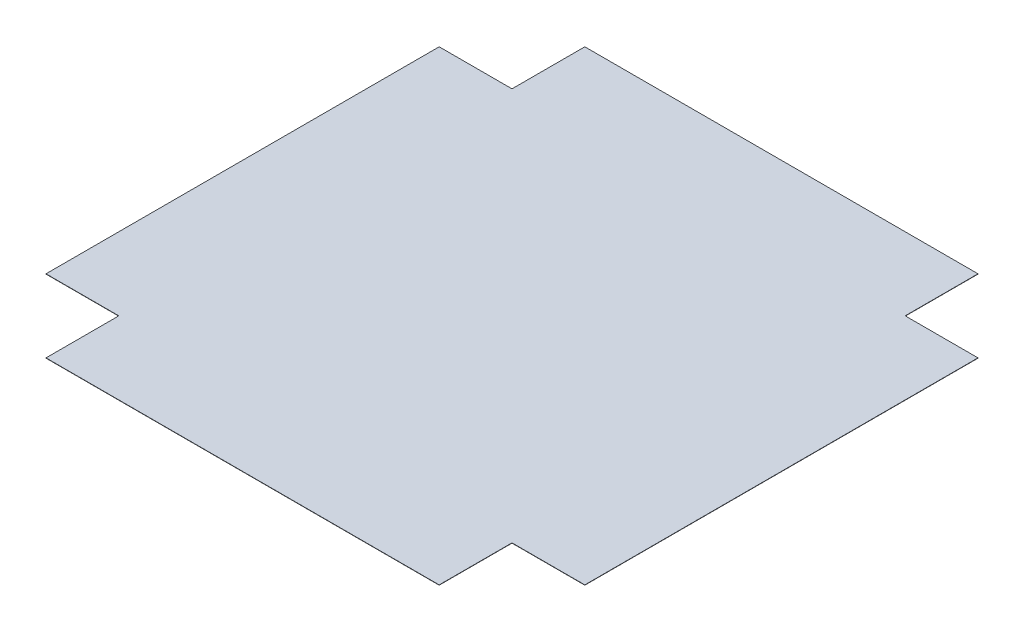
ISO-10303-21;
HEADER;
FILE_DESCRIPTION(('STEP AP214'),'2;1');
FILE_NAME('part.step','',(''),(''),'','','');
FILE_SCHEMA(('AUTOMOTIVE_DESIGN { 1 0 10303 214 1 1 1 1 }'));
ENDSEC;
DATA;
#1=APPLICATION_CONTEXT('core data for automotive mechanical design processes');
#2=APPLICATION_PROTOCOL_DEFINITION('international standard','automotive_design',2000,#1);
#3=PRODUCT_CONTEXT('',#1,'mechanical');
#4=PRODUCT('Part','Part','',(#3));
#5=PRODUCT_RELATED_PRODUCT_CATEGORY('part','',(#4));
#6=PRODUCT_DEFINITION_FORMATION('','',#4);
#7=PRODUCT_DEFINITION_CONTEXT('part definition',#1,'design');
#8=PRODUCT_DEFINITION('design','',#6,#7);
#9=PRODUCT_DEFINITION_SHAPE('','',#8);
#10=(LENGTH_UNIT() NAMED_UNIT(*) SI_UNIT(.MILLI.,.METRE.));
#11=(NAMED_UNIT(*) PLANE_ANGLE_UNIT() SI_UNIT($,.RADIAN.));
#12=(NAMED_UNIT(*) SI_UNIT($,.STERADIAN.) SOLID_ANGLE_UNIT());
#13=UNCERTAINTY_MEASURE_WITH_UNIT(LENGTH_MEASURE(1.E-05),#10,'distance_accuracy_value','');
#14=(GEOMETRIC_REPRESENTATION_CONTEXT(3) GLOBAL_UNCERTAINTY_ASSIGNED_CONTEXT((#13)) GLOBAL_UNIT_ASSIGNED_CONTEXT((#10,
#11,#12)) REPRESENTATION_CONTEXT('',''));
#15=CARTESIAN_POINT('',(0.,0.,0.));
#16=DIRECTION('',(0.,0.,1.));
#17=DIRECTION('',(1.,0.,0.));
#18=AXIS2_PLACEMENT_3D('',#15,#16,#17);
#19=CARTESIAN_POINT('',(-67.5,0.05,-67.5));
#20=DIRECTION('',(1.,0.,0.));
#21=DIRECTION('',(0.,0.,-1.));
#22=AXIS2_PLACEMENT_3D('',#19,#20,#21);
#23=PLANE('',#22);
#24=DIRECTION('',(0.,0.,1.));
#25=VECTOR('',#24,1.);
#26=CARTESIAN_POINT('',(-67.5,-0.05,-67.5));
#27=LINE('',#26,#25);
#28=CARTESIAN_POINT('',(-67.5,-0.05,-92.5));
#29=VERTEX_POINT('',#28);
#30=CARTESIAN_POINT('',(-67.5,-0.05,-67.5));
#31=VERTEX_POINT('',#30);
#32=EDGE_CURVE('E166',#29,#31,#27,.T.);
#33=ORIENTED_EDGE('',*,*,#32,.T.);
#34=DIRECTION('',(0.,-1.,0.));
#35=VECTOR('',#34,1.);
#36=CARTESIAN_POINT('',(-67.5,0.05,-67.5));
#37=LINE('',#36,#35);
#38=CARTESIAN_POINT('',(-67.5,0.05,-67.5));
#39=VERTEX_POINT('',#38);
#40=EDGE_CURVE('E11',#39,#31,#37,.T.);
#41=ORIENTED_EDGE('',*,*,#40,.F.);
#42=DIRECTION('',(0.,0.,1.));
#43=VECTOR('',#42,1.);
#44=CARTESIAN_POINT('',(-67.5,0.05,-67.5));
#45=LINE('',#44,#43);
#46=CARTESIAN_POINT('',(-67.5,0.05,-92.5));
#47=VERTEX_POINT('',#46);
#48=EDGE_CURVE('E191',#47,#39,#45,.T.);
#49=ORIENTED_EDGE('',*,*,#48,.F.);
#50=DIRECTION('',(0.,-1.,0.));
#51=VECTOR('',#50,1.);
#52=CARTESIAN_POINT('',(-67.5,0.05,-92.5));
#53=LINE('',#52,#51);
#54=EDGE_CURVE('E162',#47,#29,#53,.T.);
#55=ORIENTED_EDGE('',*,*,#54,.T.);
#56=EDGE_LOOP('',(#33,#41,#49,#55));
#57=FACE_BOUND('',#56,.T.);
#58=ADVANCED_FACE('F42',(#57),#23,.F.);
#59=CARTESIAN_POINT('',(-92.5,0.05,-67.5));
#60=DIRECTION('',(0.,0.,1.));
#61=DIRECTION('',(1.,0.,0.));
#62=AXIS2_PLACEMENT_3D('',#59,#60,#61);
#63=PLANE('',#62);
#64=DIRECTION('',(-1.,0.,0.));
#65=VECTOR('',#64,1.);
#66=CARTESIAN_POINT('',(-92.5,-0.05,-67.5));
#67=LINE('',#66,#65);
#68=CARTESIAN_POINT('',(-92.5,-0.05,-67.5));
#69=VERTEX_POINT('',#68);
#70=EDGE_CURVE('E169',#31,#69,#67,.T.);
#71=ORIENTED_EDGE('',*,*,#70,.T.);
#72=DIRECTION('',(0.,-1.,0.));
#73=VECTOR('',#72,1.);
#74=CARTESIAN_POINT('',(-92.5,0.05,-67.5));
#75=LINE('',#74,#73);
#76=CARTESIAN_POINT('',(-92.5,0.05,-67.5));
#77=VERTEX_POINT('',#76);
#78=EDGE_CURVE('E50',#77,#69,#75,.T.);
#79=ORIENTED_EDGE('',*,*,#78,.F.);
#80=DIRECTION('',(-1.,0.,0.));
#81=VECTOR('',#80,1.);
#82=CARTESIAN_POINT('',(-92.5,0.05,-67.5));
#83=LINE('',#82,#81);
#84=EDGE_CURVE('E115',#39,#77,#83,.T.);
#85=ORIENTED_EDGE('',*,*,#84,.F.);
#86=ORIENTED_EDGE('',*,*,#40,.T.);
#87=EDGE_LOOP('',(#71,#79,#85,#86));
#88=FACE_BOUND('',#87,.T.);
#89=ADVANCED_FACE('F274',(#88),#63,.F.);
#90=CARTESIAN_POINT('',(-92.5,0.05,67.5));
#91=DIRECTION('',(1.,0.,0.));
#92=DIRECTION('',(0.,0.,-1.));
#93=AXIS2_PLACEMENT_3D('',#90,#91,#92);
#94=PLANE('',#93);
#95=DIRECTION('',(0.,0.,1.));
#96=VECTOR('',#95,1.);
#97=CARTESIAN_POINT('',(-92.5,-0.05,67.5));
#98=LINE('',#97,#96);
#99=CARTESIAN_POINT('',(-92.5,-0.05,67.5));
#100=VERTEX_POINT('',#99);
#101=EDGE_CURVE('E171',#69,#100,#98,.T.);
#102=ORIENTED_EDGE('',*,*,#101,.T.);
#103=DIRECTION('',(0.,-1.,0.));
#104=VECTOR('',#103,1.);
#105=CARTESIAN_POINT('',(-92.5,0.05,67.5));
#106=LINE('',#105,#104);
#107=CARTESIAN_POINT('',(-92.5,0.05,67.5));
#108=VERTEX_POINT('',#107);
#109=EDGE_CURVE('E212',#108,#100,#106,.T.);
#110=ORIENTED_EDGE('',*,*,#109,.F.);
#111=DIRECTION('',(0.,0.,1.));
#112=VECTOR('',#111,1.);
#113=CARTESIAN_POINT('',(-92.5,0.05,67.5));
#114=LINE('',#113,#112);
#115=EDGE_CURVE('E220',#77,#108,#114,.T.);
#116=ORIENTED_EDGE('',*,*,#115,.F.);
#117=ORIENTED_EDGE('',*,*,#78,.T.);
#118=EDGE_LOOP('',(#102,#110,#116,#117));
#119=FACE_BOUND('',#118,.T.);
#120=ADVANCED_FACE('F218',(#119),#94,.F.);
#121=CARTESIAN_POINT('',(-67.5,0.05,67.5));
#122=DIRECTION('',(0.,0.,-1.));
#123=DIRECTION('',(-1.,0.,0.));
#124=AXIS2_PLACEMENT_3D('',#121,#122,#123);
#125=PLANE('',#124);
#126=DIRECTION('',(1.,0.,0.));
#127=VECTOR('',#126,1.);
#128=CARTESIAN_POINT('',(-67.5,-0.05,67.5));
#129=LINE('',#128,#127);
#130=CARTESIAN_POINT('',(-67.5,-0.05,67.5));
#131=VERTEX_POINT('',#130);
#132=EDGE_CURVE('E173',#100,#131,#129,.T.);
#133=ORIENTED_EDGE('',*,*,#132,.T.);
#134=DIRECTION('',(0.,-1.,0.));
#135=VECTOR('',#134,1.);
#136=CARTESIAN_POINT('',(-67.5,0.05,67.5));
#137=LINE('',#136,#135);
#138=CARTESIAN_POINT('',(-67.5,0.05,67.5));
#139=VERTEX_POINT('',#138);
#140=EDGE_CURVE('E209',#139,#131,#137,.T.);
#141=ORIENTED_EDGE('',*,*,#140,.F.);
#142=DIRECTION('',(1.,0.,0.));
#143=VECTOR('',#142,1.);
#144=CARTESIAN_POINT('',(-67.5,0.05,67.5));
#145=LINE('',#144,#143);
#146=EDGE_CURVE('E239',#108,#139,#145,.T.);
#147=ORIENTED_EDGE('',*,*,#146,.F.);
#148=ORIENTED_EDGE('',*,*,#109,.T.);
#149=EDGE_LOOP('',(#133,#141,#147,#148));
#150=FACE_BOUND('',#149,.T.);
#151=ADVANCED_FACE('F229',(#150),#125,.F.);
#152=CARTESIAN_POINT('',(-67.5,0.05,92.5));
#153=DIRECTION('',(1.,0.,0.));
#154=DIRECTION('',(0.,0.,-1.));
#155=AXIS2_PLACEMENT_3D('',#152,#153,#154);
#156=PLANE('',#155);
#157=DIRECTION('',(0.,0.,1.));
#158=VECTOR('',#157,1.);
#159=CARTESIAN_POINT('',(-67.5,-0.05,92.5));
#160=LINE('',#159,#158);
#161=CARTESIAN_POINT('',(-67.5,-0.05,92.5));
#162=VERTEX_POINT('',#161);
#163=EDGE_CURVE('E175',#131,#162,#160,.T.);
#164=ORIENTED_EDGE('',*,*,#163,.T.);
#165=DIRECTION('',(0.,-1.,0.));
#166=VECTOR('',#165,1.);
#167=CARTESIAN_POINT('',(-67.5,0.05,92.5));
#168=LINE('',#167,#166);
#169=CARTESIAN_POINT('',(-67.5,0.05,92.5));
#170=VERTEX_POINT('',#169);
#171=EDGE_CURVE('E205',#170,#162,#168,.T.);
#172=ORIENTED_EDGE('',*,*,#171,.F.);
#173=DIRECTION('',(0.,0.,1.));
#174=VECTOR('',#173,1.);
#175=CARTESIAN_POINT('',(-67.5,0.05,92.5));
#176=LINE('',#175,#174);
#177=EDGE_CURVE('E235',#139,#170,#176,.T.);
#178=ORIENTED_EDGE('',*,*,#177,.F.);
#179=ORIENTED_EDGE('',*,*,#140,.T.);
#180=EDGE_LOOP('',(#164,#172,#178,#179));
#181=FACE_BOUND('',#180,.T.);
#182=ADVANCED_FACE('F233',(#181),#156,.F.);
#183=CARTESIAN_POINT('',(67.5,0.05,92.5));
#184=DIRECTION('',(0.,0.,-1.));
#185=DIRECTION('',(-1.,0.,0.));
#186=AXIS2_PLACEMENT_3D('',#183,#184,#185);
#187=PLANE('',#186);
#188=DIRECTION('',(1.,0.,0.));
#189=VECTOR('',#188,1.);
#190=CARTESIAN_POINT('',(67.5,-0.05,92.5));
#191=LINE('',#190,#189);
#192=CARTESIAN_POINT('',(67.5,-0.05,92.5));
#193=VERTEX_POINT('',#192);
#194=EDGE_CURVE('E178',#162,#193,#191,.T.);
#195=ORIENTED_EDGE('',*,*,#194,.T.);
#196=DIRECTION('',(0.,-1.,0.));
#197=VECTOR('',#196,1.);
#198=CARTESIAN_POINT('',(67.5,0.05,92.5));
#199=LINE('',#198,#197);
#200=CARTESIAN_POINT('',(67.5,0.05,92.5));
#201=VERTEX_POINT('',#200);
#202=EDGE_CURVE('E201',#201,#193,#199,.T.);
#203=ORIENTED_EDGE('',*,*,#202,.F.);
#204=DIRECTION('',(1.,0.,0.));
#205=VECTOR('',#204,1.);
#206=CARTESIAN_POINT('',(67.5,0.05,92.5));
#207=LINE('',#206,#205);
#208=EDGE_CURVE('E238',#170,#201,#207,.T.);
#209=ORIENTED_EDGE('',*,*,#208,.F.);
#210=ORIENTED_EDGE('',*,*,#171,.T.);
#211=EDGE_LOOP('',(#195,#203,#209,#210));
#212=FACE_BOUND('',#211,.T.);
#213=ADVANCED_FACE('F287',(#212),#187,.F.);
#214=CARTESIAN_POINT('',(67.5,0.05,67.5));
#215=DIRECTION('',(-1.,0.,0.));
#216=DIRECTION('',(0.,0.,1.));
#217=AXIS2_PLACEMENT_3D('',#214,#215,#216);
#218=PLANE('',#217);
#219=DIRECTION('',(0.,0.,-1.));
#220=VECTOR('',#219,1.);
#221=CARTESIAN_POINT('',(67.5,-0.05,67.5));
#222=LINE('',#221,#220);
#223=CARTESIAN_POINT('',(67.5,-0.05,67.5));
#224=VERTEX_POINT('',#223);
#225=EDGE_CURVE('E181',#193,#224,#222,.T.);
#226=ORIENTED_EDGE('',*,*,#225,.T.);
#227=DIRECTION('',(0.,-1.,0.));
#228=VECTOR('',#227,1.);
#229=CARTESIAN_POINT('',(67.5,0.05,67.5));
#230=LINE('',#229,#228);
#231=CARTESIAN_POINT('',(67.5,0.05,67.5));
#232=VERTEX_POINT('',#231);
#233=EDGE_CURVE('E198',#232,#224,#230,.T.);
#234=ORIENTED_EDGE('',*,*,#233,.F.);
#235=DIRECTION('',(0.,0.,-1.));
#236=VECTOR('',#235,1.);
#237=CARTESIAN_POINT('',(67.5,0.05,67.5));
#238=LINE('',#237,#236);
#239=EDGE_CURVE('E242',#201,#232,#238,.T.);
#240=ORIENTED_EDGE('',*,*,#239,.F.);
#241=ORIENTED_EDGE('',*,*,#202,.T.);
#242=EDGE_LOOP('',(#226,#234,#240,#241));
#243=FACE_BOUND('',#242,.T.);
#244=ADVANCED_FACE('F290',(#243),#218,.F.);
#245=CARTESIAN_POINT('',(92.5,0.05,67.5));
#246=DIRECTION('',(0.,0.,-1.));
#247=DIRECTION('',(-1.,0.,0.));
#248=AXIS2_PLACEMENT_3D('',#245,#246,#247);
#249=PLANE('',#248);
#250=DIRECTION('',(1.,0.,0.));
#251=VECTOR('',#250,1.);
#252=CARTESIAN_POINT('',(92.5,-0.05,67.5));
#253=LINE('',#252,#251);
#254=CARTESIAN_POINT('',(92.5,-0.05,67.5));
#255=VERTEX_POINT('',#254);
#256=EDGE_CURVE('E184',#224,#255,#253,.T.);
#257=ORIENTED_EDGE('',*,*,#256,.T.);
#258=DIRECTION('',(0.,-1.,0.));
#259=VECTOR('',#258,1.);
#260=CARTESIAN_POINT('',(92.5,0.05,67.5));
#261=LINE('',#260,#259);
#262=CARTESIAN_POINT('',(92.5,0.05,67.5));
#263=VERTEX_POINT('',#262);
#264=EDGE_CURVE('E195',#263,#255,#261,.T.);
#265=ORIENTED_EDGE('',*,*,#264,.F.);
#266=DIRECTION('',(1.,0.,0.));
#267=VECTOR('',#266,1.);
#268=CARTESIAN_POINT('',(92.5,0.05,67.5));
#269=LINE('',#268,#267);
#270=EDGE_CURVE('E249',#232,#263,#269,.T.);
#271=ORIENTED_EDGE('',*,*,#270,.F.);
#272=ORIENTED_EDGE('',*,*,#233,.T.);
#273=EDGE_LOOP('',(#257,#265,#271,#272));
#274=FACE_BOUND('',#273,.T.);
#275=ADVANCED_FACE('F255',(#274),#249,.F.);
#276=CARTESIAN_POINT('',(92.5,0.05,-67.5));
#277=DIRECTION('',(-1.,0.,0.));
#278=DIRECTION('',(0.,0.,1.));
#279=AXIS2_PLACEMENT_3D('',#276,#277,#278);
#280=PLANE('',#279);
#281=DIRECTION('',(0.,0.,-1.));
#282=VECTOR('',#281,1.);
#283=CARTESIAN_POINT('',(92.5,-0.05,-67.5));
#284=LINE('',#283,#282);
#285=CARTESIAN_POINT('',(92.5,-0.05,-67.5));
#286=VERTEX_POINT('',#285);
#287=EDGE_CURVE('E186',#255,#286,#284,.T.);
#288=ORIENTED_EDGE('',*,*,#287,.T.);
#289=DIRECTION('',(0.,-1.,0.));
#290=VECTOR('',#289,1.);
#291=CARTESIAN_POINT('',(92.5,0.05,-67.5));
#292=LINE('',#291,#290);
#293=CARTESIAN_POINT('',(92.5,0.05,-67.5));
#294=VERTEX_POINT('',#293);
#295=EDGE_CURVE('E157',#294,#286,#292,.T.);
#296=ORIENTED_EDGE('',*,*,#295,.F.);
#297=DIRECTION('',(0.,0.,-1.));
#298=VECTOR('',#297,1.);
#299=CARTESIAN_POINT('',(92.5,0.05,-67.5));
#300=LINE('',#299,#298);
#301=EDGE_CURVE('E148',#263,#294,#300,.T.);
#302=ORIENTED_EDGE('',*,*,#301,.F.);
#303=ORIENTED_EDGE('',*,*,#264,.T.);
#304=EDGE_LOOP('',(#288,#296,#302,#303));
#305=FACE_BOUND('',#304,.T.);
#306=ADVANCED_FACE('F259',(#305),#280,.F.);
#307=CARTESIAN_POINT('',(67.5,0.05,-67.5));
#308=DIRECTION('',(0.,0.,1.));
#309=DIRECTION('',(1.,0.,0.));
#310=AXIS2_PLACEMENT_3D('',#307,#308,#309);
#311=PLANE('',#310);
#312=DIRECTION('',(-1.,0.,0.));
#313=VECTOR('',#312,1.);
#314=CARTESIAN_POINT('',(67.5,-0.05,-67.5));
#315=LINE('',#314,#313);
#316=CARTESIAN_POINT('',(67.5,-0.05,-67.5));
#317=VERTEX_POINT('',#316);
#318=EDGE_CURVE('E156',#286,#317,#315,.T.);
#319=ORIENTED_EDGE('',*,*,#318,.T.);
#320=DIRECTION('',(0.,-1.,0.));
#321=VECTOR('',#320,1.);
#322=CARTESIAN_POINT('',(67.5,0.05,-67.5));
#323=LINE('',#322,#321);
#324=CARTESIAN_POINT('',(67.5,0.05,-67.5));
#325=VERTEX_POINT('',#324);
#326=EDGE_CURVE('E153',#325,#317,#323,.T.);
#327=ORIENTED_EDGE('',*,*,#326,.F.);
#328=DIRECTION('',(-1.,0.,0.));
#329=VECTOR('',#328,1.);
#330=CARTESIAN_POINT('',(67.5,0.05,-67.5));
#331=LINE('',#330,#329);
#332=EDGE_CURVE('E142',#294,#325,#331,.T.);
#333=ORIENTED_EDGE('',*,*,#332,.F.);
#334=ORIENTED_EDGE('',*,*,#295,.T.);
#335=EDGE_LOOP('',(#319,#327,#333,#334));
#336=FACE_BOUND('',#335,.T.);
#337=ADVANCED_FACE('F154',(#336),#311,.F.);
#338=CARTESIAN_POINT('',(67.5,0.05,-92.5));
#339=DIRECTION('',(-1.,0.,0.));
#340=DIRECTION('',(0.,0.,1.));
#341=AXIS2_PLACEMENT_3D('',#338,#339,#340);
#342=PLANE('',#341);
#343=DIRECTION('',(0.,0.,-1.));
#344=VECTOR('',#343,1.);
#345=CARTESIAN_POINT('',(67.5,-0.05,-92.5));
#346=LINE('',#345,#344);
#347=CARTESIAN_POINT('',(67.5,-0.05,-92.5));
#348=VERTEX_POINT('',#347);
#349=EDGE_CURVE('E101',#317,#348,#346,.T.);
#350=ORIENTED_EDGE('',*,*,#349,.T.);
#351=DIRECTION('',(0.,-1.,0.));
#352=VECTOR('',#351,1.);
#353=CARTESIAN_POINT('',(67.5,0.05,-92.5));
#354=LINE('',#353,#352);
#355=CARTESIAN_POINT('',(67.5,0.05,-92.5));
#356=VERTEX_POINT('',#355);
#357=EDGE_CURVE('E158',#356,#348,#354,.T.);
#358=ORIENTED_EDGE('',*,*,#357,.F.);
#359=DIRECTION('',(0.,0.,-1.));
#360=VECTOR('',#359,1.);
#361=CARTESIAN_POINT('',(67.5,0.05,-92.5));
#362=LINE('',#361,#360);
#363=EDGE_CURVE('E146',#325,#356,#362,.T.);
#364=ORIENTED_EDGE('',*,*,#363,.F.);
#365=ORIENTED_EDGE('',*,*,#326,.T.);
#366=EDGE_LOOP('',(#350,#358,#364,#365));
#367=FACE_BOUND('',#366,.T.);
#368=ADVANCED_FACE('F160',(#367),#342,.F.);
#369=CARTESIAN_POINT('',(-67.5,0.05,-92.5));
#370=DIRECTION('',(0.,0.,1.));
#371=DIRECTION('',(1.,0.,0.));
#372=AXIS2_PLACEMENT_3D('',#369,#370,#371);
#373=PLANE('',#372);
#374=DIRECTION('',(-1.,0.,0.));
#375=VECTOR('',#374,1.);
#376=CARTESIAN_POINT('',(-67.5,-0.05,-92.5));
#377=LINE('',#376,#375);
#378=EDGE_CURVE('E107',#348,#29,#377,.T.);
#379=ORIENTED_EDGE('',*,*,#378,.T.);
#380=ORIENTED_EDGE('',*,*,#54,.F.);
#381=DIRECTION('',(-1.,0.,0.));
#382=VECTOR('',#381,1.);
#383=CARTESIAN_POINT('',(-67.5,0.05,-92.5));
#384=LINE('',#383,#382);
#385=EDGE_CURVE('E58',#356,#47,#384,.T.);
#386=ORIENTED_EDGE('',*,*,#385,.F.);
#387=ORIENTED_EDGE('',*,*,#357,.T.);
#388=EDGE_LOOP('',(#379,#380,#386,#387));
#389=FACE_BOUND('',#388,.T.);
#390=ADVANCED_FACE('F263',(#389),#373,.F.);
#391=CARTESIAN_POINT('',(0.,0.05,0.));
#392=DIRECTION('',(0.,-1.,0.));
#393=DIRECTION('',(0.,0.,-1.));
#394=AXIS2_PLACEMENT_3D('',#391,#392,#393);
#395=PLANE('',#394);
#396=ORIENTED_EDGE('',*,*,#48,.T.);
#397=ORIENTED_EDGE('',*,*,#84,.T.);
#398=ORIENTED_EDGE('',*,*,#115,.T.);
#399=ORIENTED_EDGE('',*,*,#146,.T.);
#400=ORIENTED_EDGE('',*,*,#177,.T.);
#401=ORIENTED_EDGE('',*,*,#208,.T.);
#402=ORIENTED_EDGE('',*,*,#239,.T.);
#403=ORIENTED_EDGE('',*,*,#270,.T.);
#404=ORIENTED_EDGE('',*,*,#301,.T.);
#405=ORIENTED_EDGE('',*,*,#332,.T.);
#406=ORIENTED_EDGE('',*,*,#363,.T.);
#407=ORIENTED_EDGE('',*,*,#385,.T.);
#408=EDGE_LOOP('',(#396,#397,#398,#399,#400,#401,#402,#403,#404,#405,#406,#407));
#409=FACE_BOUND('',#408,.T.);
#410=ADVANCED_FACE('F144',(#409),#395,.F.);
#411=CARTESIAN_POINT('',(0.,-0.05,0.));
#412=DIRECTION('',(0.,-1.,0.));
#413=DIRECTION('',(0.,0.,-1.));
#414=AXIS2_PLACEMENT_3D('',#411,#412,#413);
#415=PLANE('',#414);
#416=ORIENTED_EDGE('',*,*,#32,.F.);
#417=ORIENTED_EDGE('',*,*,#378,.F.);
#418=ORIENTED_EDGE('',*,*,#349,.F.);
#419=ORIENTED_EDGE('',*,*,#318,.F.);
#420=ORIENTED_EDGE('',*,*,#287,.F.);
#421=ORIENTED_EDGE('',*,*,#256,.F.);
#422=ORIENTED_EDGE('',*,*,#225,.F.);
#423=ORIENTED_EDGE('',*,*,#194,.F.);
#424=ORIENTED_EDGE('',*,*,#163,.F.);
#425=ORIENTED_EDGE('',*,*,#132,.F.);
#426=ORIENTED_EDGE('',*,*,#101,.F.);
#427=ORIENTED_EDGE('',*,*,#70,.F.);
#428=EDGE_LOOP('',(#416,#417,#418,#419,#420,#421,#422,#423,#424,#425,#426,#427));
#429=FACE_BOUND('',#428,.T.);
#430=ADVANCED_FACE('F224',(#429),#415,.T.);
#431=CLOSED_SHELL('',(#58,#89,#120,#151,#182,#213,#244,#275,#306,#337,#368,#390,#410,#430));
#432=MANIFOLD_SOLID_BREP('B2',#431);
#433=ADVANCED_BREP_SHAPE_REPRESENTATION('',(#18,#432),#14);
#434=SHAPE_DEFINITION_REPRESENTATION(#9,#433);
ENDSEC;
END-ISO-10303-21;
